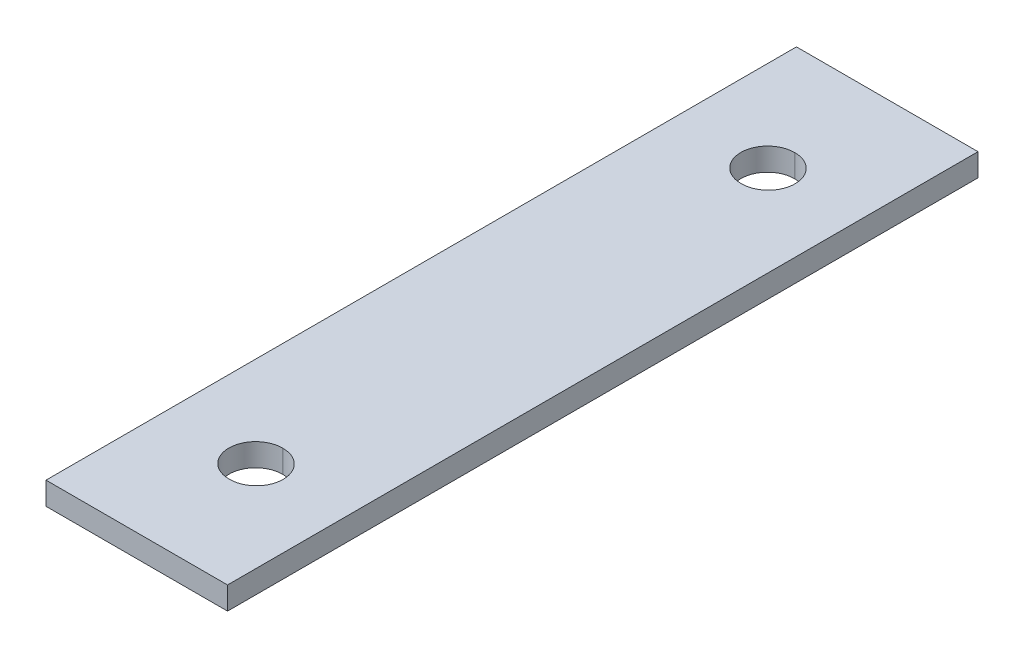
ISO-10303-21;
HEADER;
FILE_DESCRIPTION(('STEP AP214'),'2;1');
FILE_NAME('part.step','',(''),(''),'','','');
FILE_SCHEMA(('AUTOMOTIVE_DESIGN { 1 0 10303 214 1 1 1 1 }'));
ENDSEC;
DATA;
#1=APPLICATION_CONTEXT('core data for automotive mechanical design processes');
#2=APPLICATION_PROTOCOL_DEFINITION('international standard','automotive_design',2000,#1);
#3=PRODUCT_CONTEXT('',#1,'mechanical');
#4=PRODUCT('Part','Part','',(#3));
#5=PRODUCT_RELATED_PRODUCT_CATEGORY('part','',(#4));
#6=PRODUCT_DEFINITION_FORMATION('','',#4);
#7=PRODUCT_DEFINITION_CONTEXT('part definition',#1,'design');
#8=PRODUCT_DEFINITION('design','',#6,#7);
#9=PRODUCT_DEFINITION_SHAPE('','',#8);
#10=(LENGTH_UNIT() NAMED_UNIT(*) SI_UNIT(.MILLI.,.METRE.));
#11=(NAMED_UNIT(*) PLANE_ANGLE_UNIT() SI_UNIT($,.RADIAN.));
#12=(NAMED_UNIT(*) SI_UNIT($,.STERADIAN.) SOLID_ANGLE_UNIT());
#13=UNCERTAINTY_MEASURE_WITH_UNIT(LENGTH_MEASURE(1.E-05),#10,'distance_accuracy_value','');
#14=(GEOMETRIC_REPRESENTATION_CONTEXT(3) GLOBAL_UNCERTAINTY_ASSIGNED_CONTEXT((#13)) GLOBAL_UNIT_ASSIGNED_CONTEXT((#10,
#11,#12)) REPRESENTATION_CONTEXT('',''));
#15=CARTESIAN_POINT('',(0.,0.,0.));
#16=DIRECTION('',(0.,0.,1.));
#17=DIRECTION('',(1.,0.,0.));
#18=AXIS2_PLACEMENT_3D('',#15,#16,#17);
#19=CARTESIAN_POINT('',(-12.7,3.175,52.5));
#20=DIRECTION('',(1.,0.,0.));
#21=DIRECTION('',(0.,0.,-1.));
#22=AXIS2_PLACEMENT_3D('',#19,#20,#21);
#23=PLANE('',#22);
#24=DIRECTION('',(0.,0.,1.));
#25=VECTOR('',#24,1.);
#26=CARTESIAN_POINT('',(-12.7,0.,52.5));
#27=LINE('',#26,#25);
#28=CARTESIAN_POINT('',(-12.7,0.,-52.5));
#29=VERTEX_POINT('',#28);
#30=CARTESIAN_POINT('',(-12.7,0.,52.5));
#31=VERTEX_POINT('',#30);
#32=EDGE_CURVE('E167',#29,#31,#27,.T.);
#33=ORIENTED_EDGE('',*,*,#32,.T.);
#34=DIRECTION('',(0.,-1.,0.));
#35=VECTOR('',#34,1.);
#36=CARTESIAN_POINT('',(-12.7,3.175,52.5));
#37=LINE('',#36,#35);
#38=CARTESIAN_POINT('',(-12.7,3.175,52.5));
#39=VERTEX_POINT('',#38);
#40=EDGE_CURVE('E11',#39,#31,#37,.T.);
#41=ORIENTED_EDGE('',*,*,#40,.F.);
#42=DIRECTION('',(0.,0.,1.));
#43=VECTOR('',#42,1.);
#44=CARTESIAN_POINT('',(-12.7,3.175,52.5));
#45=LINE('',#44,#43);
#46=CARTESIAN_POINT('',(-12.7,3.175,-52.5));
#47=VERTEX_POINT('',#46);
#48=EDGE_CURVE('E201',#47,#39,#45,.T.);
#49=ORIENTED_EDGE('',*,*,#48,.F.);
#50=DIRECTION('',(0.,-1.,0.));
#51=VECTOR('',#50,1.);
#52=CARTESIAN_POINT('',(-12.7,3.175,-52.5));
#53=LINE('',#52,#51);
#54=EDGE_CURVE('E211',#47,#29,#53,.T.);
#55=ORIENTED_EDGE('',*,*,#54,.T.);
#56=EDGE_LOOP('',(#33,#41,#49,#55));
#57=FACE_BOUND('',#56,.T.);
#58=ADVANCED_FACE('F43',(#57),#23,.F.);
#59=CARTESIAN_POINT('',(12.7,3.175,52.5));
#60=DIRECTION('',(0.,0.,-1.));
#61=DIRECTION('',(-1.,0.,0.));
#62=AXIS2_PLACEMENT_3D('',#59,#60,#61);
#63=PLANE('',#62);
#64=DIRECTION('',(1.,0.,0.));
#65=VECTOR('',#64,1.);
#66=CARTESIAN_POINT('',(12.7,0.,52.5));
#67=LINE('',#66,#65);
#68=CARTESIAN_POINT('',(12.7,0.,52.5));
#69=VERTEX_POINT('',#68);
#70=EDGE_CURVE('E214',#31,#69,#67,.T.);
#71=ORIENTED_EDGE('',*,*,#70,.T.);
#72=DIRECTION('',(0.,-1.,0.));
#73=VECTOR('',#72,1.);
#74=CARTESIAN_POINT('',(12.7,3.175,52.5));
#75=LINE('',#74,#73);
#76=CARTESIAN_POINT('',(12.7,3.175,52.5));
#77=VERTEX_POINT('',#76);
#78=EDGE_CURVE('E50',#77,#69,#75,.T.);
#79=ORIENTED_EDGE('',*,*,#78,.F.);
#80=DIRECTION('',(1.,0.,0.));
#81=VECTOR('',#80,1.);
#82=CARTESIAN_POINT('',(12.7,3.175,52.5));
#83=LINE('',#82,#81);
#84=EDGE_CURVE('E204',#39,#77,#83,.T.);
#85=ORIENTED_EDGE('',*,*,#84,.F.);
#86=ORIENTED_EDGE('',*,*,#40,.T.);
#87=EDGE_LOOP('',(#71,#79,#85,#86));
#88=FACE_BOUND('',#87,.T.);
#89=ADVANCED_FACE('F243',(#88),#63,.F.);
#90=CARTESIAN_POINT('',(12.7,3.175,52.5));
#91=DIRECTION('',(-1.,0.,0.));
#92=DIRECTION('',(0.,0.,1.));
#93=AXIS2_PLACEMENT_3D('',#90,#91,#92);
#94=PLANE('',#93);
#95=DIRECTION('',(0.,0.,-1.));
#96=VECTOR('',#95,1.);
#97=CARTESIAN_POINT('',(12.7,0.,52.5));
#98=LINE('',#97,#96);
#99=CARTESIAN_POINT('',(12.7,0.,-52.5));
#100=VERTEX_POINT('',#99);
#101=EDGE_CURVE('E216',#69,#100,#98,.T.);
#102=ORIENTED_EDGE('',*,*,#101,.T.);
#103=DIRECTION('',(0.,-1.,0.));
#104=VECTOR('',#103,1.);
#105=CARTESIAN_POINT('',(12.7,3.175,-52.5));
#106=LINE('',#105,#104);
#107=CARTESIAN_POINT('',(12.7,3.175,-52.5));
#108=VERTEX_POINT('',#107);
#109=EDGE_CURVE('E221',#108,#100,#106,.T.);
#110=ORIENTED_EDGE('',*,*,#109,.F.);
#111=DIRECTION('',(0.,0.,-1.));
#112=VECTOR('',#111,1.);
#113=CARTESIAN_POINT('',(12.7,3.175,52.5));
#114=LINE('',#113,#112);
#115=EDGE_CURVE('E207',#77,#108,#114,.T.);
#116=ORIENTED_EDGE('',*,*,#115,.F.);
#117=ORIENTED_EDGE('',*,*,#78,.T.);
#118=EDGE_LOOP('',(#102,#110,#116,#117));
#119=FACE_BOUND('',#118,.T.);
#120=ADVANCED_FACE('F228',(#119),#94,.F.);
#121=CARTESIAN_POINT('',(12.7,3.175,-52.5));
#122=DIRECTION('',(0.,0.,1.));
#123=DIRECTION('',(1.,0.,0.));
#124=AXIS2_PLACEMENT_3D('',#121,#122,#123);
#125=PLANE('',#124);
#126=DIRECTION('',(-1.,0.,0.));
#127=VECTOR('',#126,1.);
#128=CARTESIAN_POINT('',(12.7,0.,-52.5));
#129=LINE('',#128,#127);
#130=EDGE_CURVE('E205',#100,#29,#129,.T.);
#131=ORIENTED_EDGE('',*,*,#130,.T.);
#132=ORIENTED_EDGE('',*,*,#54,.F.);
#133=DIRECTION('',(-1.,0.,0.));
#134=VECTOR('',#133,1.);
#135=CARTESIAN_POINT('',(12.7,3.175,-52.5));
#136=LINE('',#135,#134);
#137=EDGE_CURVE('E209',#108,#47,#136,.T.);
#138=ORIENTED_EDGE('',*,*,#137,.F.);
#139=ORIENTED_EDGE('',*,*,#109,.T.);
#140=EDGE_LOOP('',(#131,#132,#138,#139));
#141=FACE_BOUND('',#140,.T.);
#142=ADVANCED_FACE('F236',(#141),#125,.F.);
#143=CARTESIAN_POINT('',(0.,3.175,0.));
#144=DIRECTION('',(0.,1.,0.));
#145=DIRECTION('',(0.,0.,1.));
#146=AXIS2_PLACEMENT_3D('',#143,#144,#145);
#147=PLANE('',#146);
#148=CARTESIAN_POINT('',(-0.0500000000000001,3.175,-35.814));
#149=DIRECTION('',(0.,1.,0.));
#150=DIRECTION('',(0.,0.,1.));
#151=AXIS2_PLACEMENT_3D('',#148,#149,#150);
#152=CIRCLE('',#151,3.75000000000001);
#153=CARTESIAN_POINT('',(-0.0500000000000001,3.175,-39.564));
#154=VERTEX_POINT('',#153);
#155=CARTESIAN_POINT('',(-0.0500000000000001,3.175,-32.064));
#156=VERTEX_POINT('',#155);
#157=EDGE_CURVE('E57',#154,#156,#152,.T.);
#158=ORIENTED_EDGE('',*,*,#157,.F.);
#159=DIRECTION('',(-1.,0.,0.));
#160=VECTOR('',#159,1.);
#161=CARTESIAN_POINT('',(-0.0500000000000001,3.175,-39.564));
#162=LINE('',#161,#160);
#163=CARTESIAN_POINT('',(0.0499999999999993,3.175,-39.564));
#164=VERTEX_POINT('',#163);
#165=EDGE_CURVE('E152',#164,#154,#162,.T.);
#166=ORIENTED_EDGE('',*,*,#165,.F.);
#167=CARTESIAN_POINT('',(0.0500000000000001,3.175,-35.814));
#168=DIRECTION('',(0.,1.,0.));
#169=DIRECTION('',(0.,0.,1.));
#170=AXIS2_PLACEMENT_3D('',#167,#168,#169);
#171=CIRCLE('',#170,3.75000000000001);
#172=CARTESIAN_POINT('',(0.050000000000001,3.175,-32.064));
#173=VERTEX_POINT('',#172);
#174=EDGE_CURVE('E155',#173,#164,#171,.T.);
#175=ORIENTED_EDGE('',*,*,#174,.F.);
#176=DIRECTION('',(1.,0.,0.));
#177=VECTOR('',#176,1.);
#178=CARTESIAN_POINT('',(-0.0500000000000001,3.175,-32.064));
#179=LINE('',#178,#177);
#180=EDGE_CURVE('E161',#156,#173,#179,.T.);
#181=ORIENTED_EDGE('',*,*,#180,.F.);
#182=EDGE_LOOP('',(#158,#166,#175,#181));
#183=FACE_BOUND('',#182,.T.);
#184=CARTESIAN_POINT('',(-0.0499999999999915,3.175,35.814));
#185=DIRECTION('',(0.,1.,0.));
#186=DIRECTION('',(0.,0.,1.));
#187=AXIS2_PLACEMENT_3D('',#184,#185,#186);
#188=CIRCLE('',#187,3.75);
#189=CARTESIAN_POINT('',(-0.0499999999999915,3.175,32.064));
#190=VERTEX_POINT('',#189);
#191=CARTESIAN_POINT('',(-0.0499999999999915,3.175,39.564));
#192=VERTEX_POINT('',#191);
#193=EDGE_CURVE('E65',#190,#192,#188,.T.);
#194=ORIENTED_EDGE('',*,*,#193,.F.);
#195=DIRECTION('',(-1.,0.,0.));
#196=VECTOR('',#195,1.);
#197=CARTESIAN_POINT('',(-0.0499999999999915,3.175,32.064));
#198=LINE('',#197,#196);
#199=CARTESIAN_POINT('',(0.0500000000000075,3.175,32.064));
#200=VERTEX_POINT('',#199);
#201=EDGE_CURVE('E180',#200,#190,#198,.T.);
#202=ORIENTED_EDGE('',*,*,#201,.F.);
#203=CARTESIAN_POINT('',(0.0500000000000088,3.175,35.814));
#204=DIRECTION('',(0.,1.,0.));
#205=DIRECTION('',(0.,0.,1.));
#206=AXIS2_PLACEMENT_3D('',#203,#204,#205);
#207=CIRCLE('',#206,3.75);
#208=CARTESIAN_POINT('',(0.0500000000000105,3.175,39.564));
#209=VERTEX_POINT('',#208);
#210=EDGE_CURVE('E183',#209,#200,#207,.T.);
#211=ORIENTED_EDGE('',*,*,#210,.F.);
#212=DIRECTION('',(1.,0.,0.));
#213=VECTOR('',#212,1.);
#214=CARTESIAN_POINT('',(-0.0499999999999915,3.175,39.564));
#215=LINE('',#214,#213);
#216=EDGE_CURVE('E187',#192,#209,#215,.T.);
#217=ORIENTED_EDGE('',*,*,#216,.F.);
#218=EDGE_LOOP('',(#194,#202,#211,#217));
#219=FACE_BOUND('',#218,.T.);
#220=ORIENTED_EDGE('',*,*,#48,.T.);
#221=ORIENTED_EDGE('',*,*,#84,.T.);
#222=ORIENTED_EDGE('',*,*,#115,.T.);
#223=ORIENTED_EDGE('',*,*,#137,.T.);
#224=EDGE_LOOP('',(#220,#221,#222,#223));
#225=FACE_BOUND('',#224,.T.);
#226=ADVANCED_FACE('F242',(#183,#219,#225),#147,.T.);
#227=CARTESIAN_POINT('',(0.,0.,0.));
#228=DIRECTION('',(0.,1.,0.));
#229=DIRECTION('',(0.,0.,1.));
#230=AXIS2_PLACEMENT_3D('',#227,#228,#229);
#231=PLANE('',#230);
#232=DIRECTION('',(-1.,0.,0.));
#233=VECTOR('',#232,1.);
#234=CARTESIAN_POINT('',(-0.0500000000000001,0.,-39.564));
#235=LINE('',#234,#233);
#236=CARTESIAN_POINT('',(0.0499999999999993,0.,-39.564));
#237=VERTEX_POINT('',#236);
#238=CARTESIAN_POINT('',(-0.0500000000000001,0.,-39.564));
#239=VERTEX_POINT('',#238);
#240=EDGE_CURVE('E139',#237,#239,#235,.T.);
#241=ORIENTED_EDGE('',*,*,#240,.T.);
#242=CARTESIAN_POINT('',(-0.0500000000000001,0.,-35.814));
#243=DIRECTION('',(0.,1.,0.));
#244=DIRECTION('',(0.,0.,1.));
#245=AXIS2_PLACEMENT_3D('',#242,#243,#244);
#246=CIRCLE('',#245,3.75000000000001);
#247=CARTESIAN_POINT('',(-0.0500000000000001,0.,-32.064));
#248=VERTEX_POINT('',#247);
#249=EDGE_CURVE('E133',#239,#248,#246,.T.);
#250=ORIENTED_EDGE('',*,*,#249,.T.);
#251=DIRECTION('',(1.,0.,0.));
#252=VECTOR('',#251,1.);
#253=CARTESIAN_POINT('',(-0.0500000000000001,0.,-32.064));
#254=LINE('',#253,#252);
#255=CARTESIAN_POINT('',(0.050000000000001,0.,-32.064));
#256=VERTEX_POINT('',#255);
#257=EDGE_CURVE('E143',#248,#256,#254,.T.);
#258=ORIENTED_EDGE('',*,*,#257,.T.);
#259=CARTESIAN_POINT('',(0.0500000000000001,0.,-35.814));
#260=DIRECTION('',(0.,1.,0.));
#261=DIRECTION('',(0.,0.,1.));
#262=AXIS2_PLACEMENT_3D('',#259,#260,#261);
#263=CIRCLE('',#262,3.75000000000001);
#264=EDGE_CURVE('E147',#256,#237,#263,.T.);
#265=ORIENTED_EDGE('',*,*,#264,.T.);
#266=EDGE_LOOP('',(#241,#250,#258,#265));
#267=FACE_BOUND('',#266,.T.);
#268=DIRECTION('',(-1.,0.,0.));
#269=VECTOR('',#268,1.);
#270=CARTESIAN_POINT('',(-0.0499999999999915,0.,32.064));
#271=LINE('',#270,#269);
#272=CARTESIAN_POINT('',(0.0500000000000075,0.,32.064));
#273=VERTEX_POINT('',#272);
#274=CARTESIAN_POINT('',(-0.0499999999999915,0.,32.064));
#275=VERTEX_POINT('',#274);
#276=EDGE_CURVE('E173',#273,#275,#271,.T.);
#277=ORIENTED_EDGE('',*,*,#276,.T.);
#278=CARTESIAN_POINT('',(-0.0499999999999915,0.,35.814));
#279=DIRECTION('',(0.,1.,0.));
#280=DIRECTION('',(0.,0.,1.));
#281=AXIS2_PLACEMENT_3D('',#278,#279,#280);
#282=CIRCLE('',#281,3.75);
#283=CARTESIAN_POINT('',(-0.0499999999999915,0.,39.564));
#284=VERTEX_POINT('',#283);
#285=EDGE_CURVE('E184',#275,#284,#282,.T.);
#286=ORIENTED_EDGE('',*,*,#285,.T.);
#287=DIRECTION('',(1.,0.,0.));
#288=VECTOR('',#287,1.);
#289=CARTESIAN_POINT('',(-0.0499999999999915,0.,39.564));
#290=LINE('',#289,#288);
#291=CARTESIAN_POINT('',(0.0500000000000105,0.,39.564));
#292=VERTEX_POINT('',#291);
#293=EDGE_CURVE('E196',#284,#292,#290,.T.);
#294=ORIENTED_EDGE('',*,*,#293,.T.);
#295=CARTESIAN_POINT('',(0.0500000000000088,0.,35.814));
#296=DIRECTION('',(0.,1.,0.));
#297=DIRECTION('',(0.,0.,1.));
#298=AXIS2_PLACEMENT_3D('',#295,#296,#297);
#299=CIRCLE('',#298,3.75);
#300=EDGE_CURVE('E193',#292,#273,#299,.T.);
#301=ORIENTED_EDGE('',*,*,#300,.T.);
#302=EDGE_LOOP('',(#277,#286,#294,#301));
#303=FACE_BOUND('',#302,.T.);
#304=ORIENTED_EDGE('',*,*,#32,.F.);
#305=ORIENTED_EDGE('',*,*,#130,.F.);
#306=ORIENTED_EDGE('',*,*,#101,.F.);
#307=ORIENTED_EDGE('',*,*,#70,.F.);
#308=EDGE_LOOP('',(#304,#305,#306,#307));
#309=FACE_BOUND('',#308,.T.);
#310=ADVANCED_FACE('F149',(#267,#303,#309),#231,.F.);
#311=CARTESIAN_POINT('',(-0.0499999999999915,0.,35.814));
#312=DIRECTION('',(0.,1.,0.));
#313=DIRECTION('',(0.,0.,1.));
#314=AXIS2_PLACEMENT_3D('',#311,#312,#313);
#315=CYLINDRICAL_SURFACE('',#314,3.75);
#316=ORIENTED_EDGE('',*,*,#193,.T.);
#317=DIRECTION('',(0.,1.,0.));
#318=VECTOR('',#317,1.);
#319=CARTESIAN_POINT('',(-0.0499999999999915,0.,39.564));
#320=LINE('',#319,#318);
#321=EDGE_CURVE('E171',#284,#192,#320,.T.);
#322=ORIENTED_EDGE('',*,*,#321,.F.);
#323=ORIENTED_EDGE('',*,*,#285,.F.);
#324=DIRECTION('',(0.,1.,0.));
#325=VECTOR('',#324,1.);
#326=CARTESIAN_POINT('',(-0.0499999999999915,0.,32.064));
#327=LINE('',#326,#325);
#328=EDGE_CURVE('E178',#275,#190,#327,.T.);
#329=ORIENTED_EDGE('',*,*,#328,.T.);
#330=EDGE_LOOP('',(#316,#322,#323,#329));
#331=FACE_BOUND('',#330,.T.);
#332=ADVANCED_FACE('F255',(#331),#315,.F.);
#333=CARTESIAN_POINT('',(-0.0499999999999915,0.,32.064));
#334=DIRECTION('',(0.,0.,-1.));
#335=DIRECTION('',(-1.,0.,0.));
#336=AXIS2_PLACEMENT_3D('',#333,#334,#335);
#337=PLANE('',#336);
#338=ORIENTED_EDGE('',*,*,#201,.T.);
#339=ORIENTED_EDGE('',*,*,#328,.F.);
#340=ORIENTED_EDGE('',*,*,#276,.F.);
#341=DIRECTION('',(0.,1.,0.));
#342=VECTOR('',#341,1.);
#343=CARTESIAN_POINT('',(0.0500000000000075,0.,32.064));
#344=LINE('',#343,#342);
#345=EDGE_CURVE('E176',#273,#200,#344,.T.);
#346=ORIENTED_EDGE('',*,*,#345,.T.);
#347=EDGE_LOOP('',(#338,#339,#340,#346));
#348=FACE_BOUND('',#347,.T.);
#349=ADVANCED_FACE('F259',(#348),#337,.F.);
#350=CARTESIAN_POINT('',(0.0500000000000088,0.,35.814));
#351=DIRECTION('',(0.,1.,0.));
#352=DIRECTION('',(0.,0.,1.));
#353=AXIS2_PLACEMENT_3D('',#350,#351,#352);
#354=CYLINDRICAL_SURFACE('',#353,3.75);
#355=ORIENTED_EDGE('',*,*,#210,.T.);
#356=ORIENTED_EDGE('',*,*,#345,.F.);
#357=ORIENTED_EDGE('',*,*,#300,.F.);
#358=DIRECTION('',(0.,1.,0.));
#359=VECTOR('',#358,1.);
#360=CARTESIAN_POINT('',(0.0500000000000105,0.,39.564));
#361=LINE('',#360,#359);
#362=EDGE_CURVE('E174',#292,#209,#361,.T.);
#363=ORIENTED_EDGE('',*,*,#362,.T.);
#364=EDGE_LOOP('',(#355,#356,#357,#363));
#365=FACE_BOUND('',#364,.T.);
#366=ADVANCED_FACE('F262',(#365),#354,.F.);
#367=CARTESIAN_POINT('',(-0.0499999999999915,0.,39.564));
#368=DIRECTION('',(0.,0.,1.));
#369=DIRECTION('',(1.,0.,0.));
#370=AXIS2_PLACEMENT_3D('',#367,#368,#369);
#371=PLANE('',#370);
#372=ORIENTED_EDGE('',*,*,#216,.T.);
#373=ORIENTED_EDGE('',*,*,#362,.F.);
#374=ORIENTED_EDGE('',*,*,#293,.F.);
#375=ORIENTED_EDGE('',*,*,#321,.T.);
#376=EDGE_LOOP('',(#372,#373,#374,#375));
#377=FACE_BOUND('',#376,.T.);
#378=ADVANCED_FACE('F266',(#377),#371,.F.);
#379=CARTESIAN_POINT('',(-0.0500000000000001,0.,-35.814));
#380=DIRECTION('',(0.,1.,0.));
#381=DIRECTION('',(0.,0.,1.));
#382=AXIS2_PLACEMENT_3D('',#379,#380,#381);
#383=CYLINDRICAL_SURFACE('',#382,3.75000000000001);
#384=ORIENTED_EDGE('',*,*,#157,.T.);
#385=DIRECTION('',(0.,1.,0.));
#386=VECTOR('',#385,1.);
#387=CARTESIAN_POINT('',(-0.0500000000000001,0.,-32.064));
#388=LINE('',#387,#386);
#389=EDGE_CURVE('E129',#248,#156,#388,.T.);
#390=ORIENTED_EDGE('',*,*,#389,.F.);
#391=ORIENTED_EDGE('',*,*,#249,.F.);
#392=DIRECTION('',(0.,1.,0.));
#393=VECTOR('',#392,1.);
#394=CARTESIAN_POINT('',(-0.0500000000000001,0.,-39.564));
#395=LINE('',#394,#393);
#396=EDGE_CURVE('E165',#239,#154,#395,.T.);
#397=ORIENTED_EDGE('',*,*,#396,.T.);
#398=EDGE_LOOP('',(#384,#390,#391,#397));
#399=FACE_BOUND('',#398,.T.);
#400=ADVANCED_FACE('F131',(#399),#383,.F.);
#401=CARTESIAN_POINT('',(-0.0500000000000001,0.,-39.564));
#402=DIRECTION('',(0.,0.,-1.));
#403=DIRECTION('',(-1.,0.,0.));
#404=AXIS2_PLACEMENT_3D('',#401,#402,#403);
#405=PLANE('',#404);
#406=ORIENTED_EDGE('',*,*,#165,.T.);
#407=ORIENTED_EDGE('',*,*,#396,.F.);
#408=ORIENTED_EDGE('',*,*,#240,.F.);
#409=DIRECTION('',(0.,1.,0.));
#410=VECTOR('',#409,1.);
#411=CARTESIAN_POINT('',(0.0499999999999993,0.,-39.564));
#412=LINE('',#411,#410);
#413=EDGE_CURVE('E168',#237,#164,#412,.T.);
#414=ORIENTED_EDGE('',*,*,#413,.T.);
#415=EDGE_LOOP('',(#406,#407,#408,#414));
#416=FACE_BOUND('',#415,.T.);
#417=ADVANCED_FACE('F275',(#416),#405,.F.);
#418=CARTESIAN_POINT('',(0.0500000000000001,0.,-35.814));
#419=DIRECTION('',(0.,1.,0.));
#420=DIRECTION('',(0.,0.,1.));
#421=AXIS2_PLACEMENT_3D('',#418,#419,#420);
#422=CYLINDRICAL_SURFACE('',#421,3.75000000000001);
#423=ORIENTED_EDGE('',*,*,#174,.T.);
#424=ORIENTED_EDGE('',*,*,#413,.F.);
#425=ORIENTED_EDGE('',*,*,#264,.F.);
#426=DIRECTION('',(0.,1.,0.));
#427=VECTOR('',#426,1.);
#428=CARTESIAN_POINT('',(0.050000000000001,0.,-32.064));
#429=LINE('',#428,#427);
#430=EDGE_CURVE('E138',#256,#173,#429,.T.);
#431=ORIENTED_EDGE('',*,*,#430,.T.);
#432=EDGE_LOOP('',(#423,#424,#425,#431));
#433=FACE_BOUND('',#432,.T.);
#434=ADVANCED_FACE('F278',(#433),#422,.F.);
#435=CARTESIAN_POINT('',(-0.0500000000000001,0.,-32.064));
#436=DIRECTION('',(0.,0.,1.));
#437=DIRECTION('',(1.,0.,0.));
#438=AXIS2_PLACEMENT_3D('',#435,#436,#437);
#439=PLANE('',#438);
#440=ORIENTED_EDGE('',*,*,#180,.T.);
#441=ORIENTED_EDGE('',*,*,#430,.F.);
#442=ORIENTED_EDGE('',*,*,#257,.F.);
#443=ORIENTED_EDGE('',*,*,#389,.T.);
#444=EDGE_LOOP('',(#440,#441,#442,#443));
#445=FACE_BOUND('',#444,.T.);
#446=ADVANCED_FACE('F144',(#445),#439,.F.);
#447=CLOSED_SHELL('',(#58,#89,#120,#142,#226,#310,#332,#349,#366,#378,#400,#417,#434,#446));
#448=MANIFOLD_SOLID_BREP('B2',#447);
#449=ADVANCED_BREP_SHAPE_REPRESENTATION('',(#18,#448),#14);
#450=SHAPE_DEFINITION_REPRESENTATION(#9,#449);
ENDSEC;
END-ISO-10303-21;
